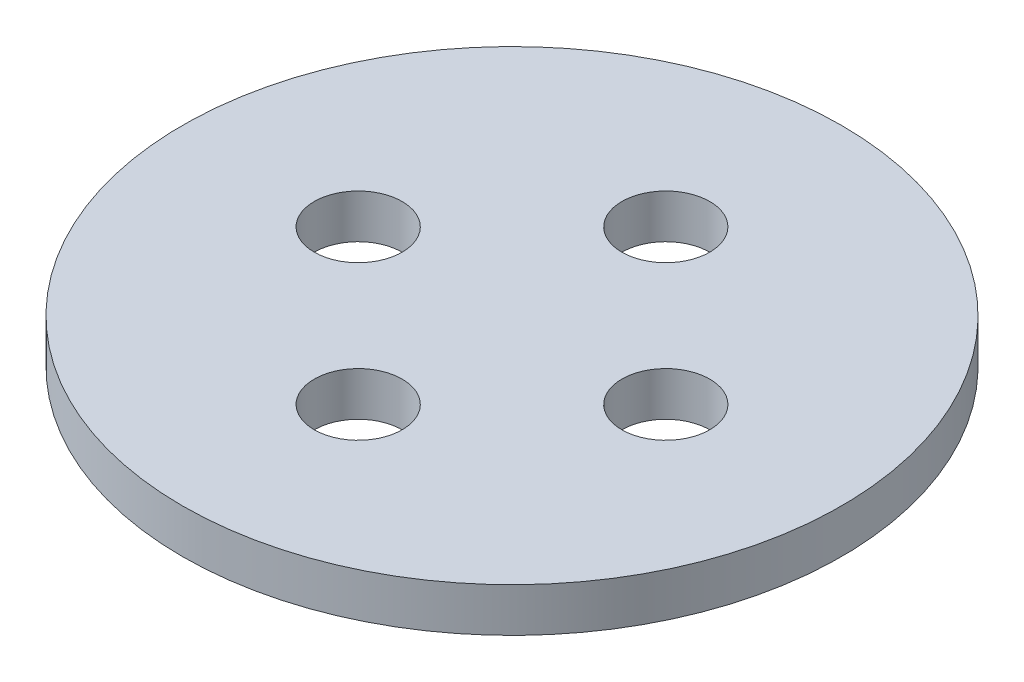
ISO-10303-21;
HEADER;
FILE_DESCRIPTION(('STEP AP214'),'2;1');
FILE_NAME('part.step','',(''),(''),'','','');
FILE_SCHEMA(('AUTOMOTIVE_DESIGN { 1 0 10303 214 1 1 1 1 }'));
ENDSEC;
DATA;
#1=APPLICATION_CONTEXT('core data for automotive mechanical design processes');
#2=APPLICATION_PROTOCOL_DEFINITION('international standard','automotive_design',2000,#1);
#3=PRODUCT_CONTEXT('',#1,'mechanical');
#4=PRODUCT('Part','Part','',(#3));
#5=PRODUCT_RELATED_PRODUCT_CATEGORY('part','',(#4));
#6=PRODUCT_DEFINITION_FORMATION('','',#4);
#7=PRODUCT_DEFINITION_CONTEXT('part definition',#1,'design');
#8=PRODUCT_DEFINITION('design','',#6,#7);
#9=PRODUCT_DEFINITION_SHAPE('','',#8);
#10=(LENGTH_UNIT() NAMED_UNIT(*) SI_UNIT(.MILLI.,.METRE.));
#11=(NAMED_UNIT(*) PLANE_ANGLE_UNIT() SI_UNIT($,.RADIAN.));
#12=(NAMED_UNIT(*) SI_UNIT($,.STERADIAN.) SOLID_ANGLE_UNIT());
#13=UNCERTAINTY_MEASURE_WITH_UNIT(LENGTH_MEASURE(1.E-05),#10,'distance_accuracy_value','');
#14=(GEOMETRIC_REPRESENTATION_CONTEXT(3) GLOBAL_UNCERTAINTY_ASSIGNED_CONTEXT((#13)) GLOBAL_UNIT_ASSIGNED_CONTEXT((#10,
#11,#12)) REPRESENTATION_CONTEXT('',''));
#15=CARTESIAN_POINT('',(0.,0.,0.));
#16=DIRECTION('',(0.,0.,1.));
#17=DIRECTION('',(1.,0.,0.));
#18=AXIS2_PLACEMENT_3D('',#15,#16,#17);
#19=CARTESIAN_POINT('',(0.,2.,0.));
#20=DIRECTION('',(0.,1.,0.));
#21=DIRECTION('',(0.,0.,1.));
#22=AXIS2_PLACEMENT_3D('',#19,#20,#21);
#23=PLANE('',#22);
#24=CARTESIAN_POINT('',(0.,2.,7.));
#25=DIRECTION('',(0.,1.,0.));
#26=DIRECTION('',(0.,0.,1.));
#27=AXIS2_PLACEMENT_3D('',#24,#25,#26);
#28=CIRCLE('',#27,2.);
#29=CARTESIAN_POINT('',(0.,2.,9.));
#30=VERTEX_POINT('',#29);
#31=EDGE_CURVE('E64',#30,#30,#28,.T.);
#32=ORIENTED_EDGE('',*,*,#31,.F.);
#33=EDGE_LOOP('',(#32));
#34=FACE_BOUND('',#33,.T.);
#35=CARTESIAN_POINT('',(0.,2.,-7.));
#36=DIRECTION('',(0.,1.,0.));
#37=DIRECTION('',(0.,0.,1.));
#38=AXIS2_PLACEMENT_3D('',#35,#36,#37);
#39=CIRCLE('',#38,2.);
#40=CARTESIAN_POINT('',(0.,2.,-5.));
#41=VERTEX_POINT('',#40);
#42=EDGE_CURVE('E50',#41,#41,#39,.T.);
#43=ORIENTED_EDGE('',*,*,#42,.F.);
#44=EDGE_LOOP('',(#43));
#45=FACE_BOUND('',#44,.T.);
#46=CARTESIAN_POINT('',(0.,2.,0.));
#47=DIRECTION('',(0.,1.,0.));
#48=DIRECTION('',(0.,0.,1.));
#49=AXIS2_PLACEMENT_3D('',#46,#47,#48);
#50=CIRCLE('',#49,15.);
#51=CARTESIAN_POINT('',(0.,2.,15.));
#52=VERTEX_POINT('',#51);
#53=EDGE_CURVE('E10',#52,#52,#50,.T.);
#54=ORIENTED_EDGE('',*,*,#53,.T.);
#55=EDGE_LOOP('',(#54));
#56=FACE_BOUND('',#55,.T.);
#57=CARTESIAN_POINT('',(7.,2.,0.));
#58=DIRECTION('',(0.,1.,0.));
#59=DIRECTION('',(0.,0.,1.));
#60=AXIS2_PLACEMENT_3D('',#57,#58,#59);
#61=CIRCLE('',#60,2.);
#62=CARTESIAN_POINT('',(7.,2.,2.00000000000002));
#63=VERTEX_POINT('',#62);
#64=EDGE_CURVE('E56',#63,#63,#61,.T.);
#65=ORIENTED_EDGE('',*,*,#64,.F.);
#66=EDGE_LOOP('',(#65));
#67=FACE_BOUND('',#66,.T.);
#68=CARTESIAN_POINT('',(-7.,2.,0.));
#69=DIRECTION('',(0.,1.,0.));
#70=DIRECTION('',(0.,0.,1.));
#71=AXIS2_PLACEMENT_3D('',#68,#69,#70);
#72=CIRCLE('',#71,2.);
#73=CARTESIAN_POINT('',(-7.,2.,1.99999999999993));
#74=VERTEX_POINT('',#73);
#75=EDGE_CURVE('E72',#74,#74,#72,.T.);
#76=ORIENTED_EDGE('',*,*,#75,.F.);
#77=EDGE_LOOP('',(#76));
#78=FACE_BOUND('',#77,.T.);
#79=ADVANCED_FACE('F37',(#34,#45,#56,#67,#78),#23,.T.);
#80=CARTESIAN_POINT('',(0.,0.,0.));
#81=DIRECTION('',(0.,1.,0.));
#82=DIRECTION('',(0.,0.,1.));
#83=AXIS2_PLACEMENT_3D('',#80,#81,#82);
#84=PLANE('',#83);
#85=CARTESIAN_POINT('',(0.,0.,0.));
#86=DIRECTION('',(0.,1.,0.));
#87=DIRECTION('',(0.,0.,1.));
#88=AXIS2_PLACEMENT_3D('',#85,#86,#87);
#89=CIRCLE('',#88,15.);
#90=CARTESIAN_POINT('',(0.,0.,15.));
#91=VERTEX_POINT('',#90);
#92=EDGE_CURVE('E41',#91,#91,#89,.T.);
#93=ORIENTED_EDGE('',*,*,#92,.F.);
#94=EDGE_LOOP('',(#93));
#95=FACE_BOUND('',#94,.T.);
#96=CARTESIAN_POINT('',(0.,0.,-7.));
#97=DIRECTION('',(0.,1.,0.));
#98=DIRECTION('',(0.,0.,1.));
#99=AXIS2_PLACEMENT_3D('',#96,#97,#98);
#100=CIRCLE('',#99,2.);
#101=CARTESIAN_POINT('',(0.,0.,-5.));
#102=VERTEX_POINT('',#101);
#103=EDGE_CURVE('E52',#102,#102,#100,.T.);
#104=ORIENTED_EDGE('',*,*,#103,.T.);
#105=EDGE_LOOP('',(#104));
#106=FACE_BOUND('',#105,.T.);
#107=CARTESIAN_POINT('',(7.,0.,0.));
#108=DIRECTION('',(0.,1.,0.));
#109=DIRECTION('',(0.,0.,1.));
#110=AXIS2_PLACEMENT_3D('',#107,#108,#109);
#111=CIRCLE('',#110,2.);
#112=CARTESIAN_POINT('',(7.,0.,2.00000000000002));
#113=VERTEX_POINT('',#112);
#114=EDGE_CURVE('E60',#113,#113,#111,.T.);
#115=ORIENTED_EDGE('',*,*,#114,.T.);
#116=EDGE_LOOP('',(#115));
#117=FACE_BOUND('',#116,.T.);
#118=CARTESIAN_POINT('',(0.,0.,7.));
#119=DIRECTION('',(0.,1.,0.));
#120=DIRECTION('',(0.,0.,1.));
#121=AXIS2_PLACEMENT_3D('',#118,#119,#120);
#122=CIRCLE('',#121,2.);
#123=CARTESIAN_POINT('',(0.,0.,9.));
#124=VERTEX_POINT('',#123);
#125=EDGE_CURVE('E68',#124,#124,#122,.T.);
#126=ORIENTED_EDGE('',*,*,#125,.T.);
#127=EDGE_LOOP('',(#126));
#128=FACE_BOUND('',#127,.T.);
#129=CARTESIAN_POINT('',(-7.,0.,0.));
#130=DIRECTION('',(0.,1.,0.));
#131=DIRECTION('',(0.,0.,1.));
#132=AXIS2_PLACEMENT_3D('',#129,#130,#131);
#133=CIRCLE('',#132,2.);
#134=CARTESIAN_POINT('',(-7.,0.,1.99999999999993));
#135=VERTEX_POINT('',#134);
#136=EDGE_CURVE('E76',#135,#135,#133,.T.);
#137=ORIENTED_EDGE('',*,*,#136,.T.);
#138=EDGE_LOOP('',(#137));
#139=FACE_BOUND('',#138,.T.);
#140=ADVANCED_FACE('F88',(#95,#106,#117,#128,#139),#84,.F.);
#141=CARTESIAN_POINT('',(0.,2.,0.));
#142=DIRECTION('',(0.,-1.,0.));
#143=DIRECTION('',(0.,0.,-1.));
#144=AXIS2_PLACEMENT_3D('',#141,#142,#143);
#145=CYLINDRICAL_SURFACE('',#144,15.);
#146=ORIENTED_EDGE('',*,*,#53,.F.);
#147=EDGE_LOOP('',(#146));
#148=FACE_BOUND('',#147,.T.);
#149=ORIENTED_EDGE('',*,*,#92,.T.);
#150=EDGE_LOOP('',(#149));
#151=FACE_BOUND('',#150,.T.);
#152=ADVANCED_FACE('F39',(#148,#151),#145,.T.);
#153=CARTESIAN_POINT('',(0.,2.,-7.));
#154=DIRECTION('',(0.,-1.,0.));
#155=DIRECTION('',(0.,0.,-1.));
#156=AXIS2_PLACEMENT_3D('',#153,#154,#155);
#157=CYLINDRICAL_SURFACE('',#156,2.);
#158=ORIENTED_EDGE('',*,*,#42,.T.);
#159=EDGE_LOOP('',(#158));
#160=FACE_BOUND('',#159,.T.);
#161=ORIENTED_EDGE('',*,*,#103,.F.);
#162=EDGE_LOOP('',(#161));
#163=FACE_BOUND('',#162,.T.);
#164=ADVANCED_FACE('F98',(#160,#163),#157,.F.);
#165=CARTESIAN_POINT('',(7.,2.,0.));
#166=DIRECTION('',(0.,-1.,0.));
#167=DIRECTION('',(0.,0.,-1.));
#168=AXIS2_PLACEMENT_3D('',#165,#166,#167);
#169=CYLINDRICAL_SURFACE('',#168,2.);
#170=ORIENTED_EDGE('',*,*,#64,.T.);
#171=EDGE_LOOP('',(#170));
#172=FACE_BOUND('',#171,.T.);
#173=ORIENTED_EDGE('',*,*,#114,.F.);
#174=EDGE_LOOP('',(#173));
#175=FACE_BOUND('',#174,.T.);
#176=ADVANCED_FACE('F101',(#172,#175),#169,.F.);
#177=CARTESIAN_POINT('',(0.,2.,7.));
#178=DIRECTION('',(0.,-1.,0.));
#179=DIRECTION('',(0.,0.,-1.));
#180=AXIS2_PLACEMENT_3D('',#177,#178,#179);
#181=CYLINDRICAL_SURFACE('',#180,2.);
#182=ORIENTED_EDGE('',*,*,#31,.T.);
#183=EDGE_LOOP('',(#182));
#184=FACE_BOUND('',#183,.T.);
#185=ORIENTED_EDGE('',*,*,#125,.F.);
#186=EDGE_LOOP('',(#185));
#187=FACE_BOUND('',#186,.T.);
#188=ADVANCED_FACE('F105',(#184,#187),#181,.F.);
#189=CARTESIAN_POINT('',(-7.,2.,0.));
#190=DIRECTION('',(0.,-1.,0.));
#191=DIRECTION('',(0.,0.,-1.));
#192=AXIS2_PLACEMENT_3D('',#189,#190,#191);
#193=CYLINDRICAL_SURFACE('',#192,2.);
#194=ORIENTED_EDGE('',*,*,#75,.T.);
#195=EDGE_LOOP('',(#194));
#196=FACE_BOUND('',#195,.T.);
#197=ORIENTED_EDGE('',*,*,#136,.F.);
#198=EDGE_LOOP('',(#197));
#199=FACE_BOUND('',#198,.T.);
#200=ADVANCED_FACE('F84',(#196,#199),#193,.F.);
#201=CLOSED_SHELL('',(#79,#140,#152,#164,#176,#188,#200));
#202=MANIFOLD_SOLID_BREP('B2',#201);
#203=ADVANCED_BREP_SHAPE_REPRESENTATION('',(#18,#202),#14);
#204=SHAPE_DEFINITION_REPRESENTATION(#9,#203);
ENDSEC;
END-ISO-10303-21;
